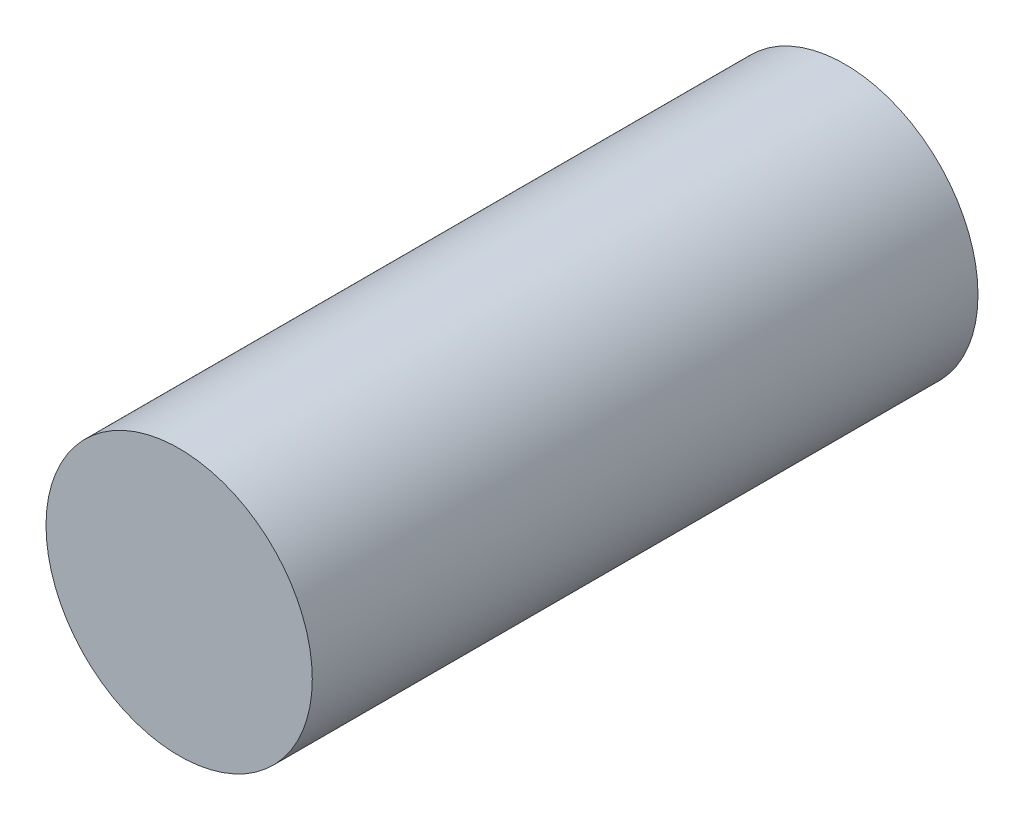
ISO-10303-21;
HEADER;
FILE_DESCRIPTION(('STEP AP214'),'2;1');
FILE_NAME('part.step','',(''),(''),'','','');
FILE_SCHEMA(('AUTOMOTIVE_DESIGN { 1 0 10303 214 1 1 1 1 }'));
ENDSEC;
DATA;
#1=APPLICATION_CONTEXT('core data for automotive mechanical design processes');
#2=APPLICATION_PROTOCOL_DEFINITION('international standard','automotive_design',2000,#1);
#3=PRODUCT_CONTEXT('',#1,'mechanical');
#4=PRODUCT('Part','Part','',(#3));
#5=PRODUCT_RELATED_PRODUCT_CATEGORY('part','',(#4));
#6=PRODUCT_DEFINITION_FORMATION('','',#4);
#7=PRODUCT_DEFINITION_CONTEXT('part definition',#1,'design');
#8=PRODUCT_DEFINITION('design','',#6,#7);
#9=PRODUCT_DEFINITION_SHAPE('','',#8);
#10=(LENGTH_UNIT() NAMED_UNIT(*) SI_UNIT(.MILLI.,.METRE.));
#11=(NAMED_UNIT(*) PLANE_ANGLE_UNIT() SI_UNIT($,.RADIAN.));
#12=(NAMED_UNIT(*) SI_UNIT($,.STERADIAN.) SOLID_ANGLE_UNIT());
#13=UNCERTAINTY_MEASURE_WITH_UNIT(LENGTH_MEASURE(1.E-05),#10,'distance_accuracy_value','');
#14=(GEOMETRIC_REPRESENTATION_CONTEXT(3) GLOBAL_UNCERTAINTY_ASSIGNED_CONTEXT((#13)) GLOBAL_UNIT_ASSIGNED_CONTEXT((#10,
#11,#12)) REPRESENTATION_CONTEXT('',''));
#15=CARTESIAN_POINT('',(0.,0.,0.));
#16=DIRECTION('',(0.,0.,1.));
#17=DIRECTION('',(1.,0.,0.));
#18=AXIS2_PLACEMENT_3D('',#15,#16,#17);
#19=CARTESIAN_POINT('',(0.,0.,100.));
#20=DIRECTION('',(0.,0.,-1.));
#21=DIRECTION('',(-1.,0.,0.));
#22=AXIS2_PLACEMENT_3D('',#19,#20,#21);
#23=CYLINDRICAL_SURFACE('',#22,20.);
#24=CARTESIAN_POINT('',(0.,0.,100.));
#25=DIRECTION('',(0.,0.,1.));
#26=DIRECTION('',(1.,0.,0.));
#27=AXIS2_PLACEMENT_3D('',#24,#25,#26);
#28=CIRCLE('',#27,20.);
#29=CARTESIAN_POINT('',(20.,0.,100.));
#30=VERTEX_POINT('',#29);
#31=EDGE_CURVE('E10',#30,#30,#28,.T.);
#32=ORIENTED_EDGE('',*,*,#31,.F.);
#33=EDGE_LOOP('',(#32));
#34=FACE_BOUND('',#33,.T.);
#35=CARTESIAN_POINT('',(0.,0.,0.));
#36=DIRECTION('',(0.,0.,1.));
#37=DIRECTION('',(1.,0.,0.));
#38=AXIS2_PLACEMENT_3D('',#35,#36,#37);
#39=CIRCLE('',#38,20.);
#40=CARTESIAN_POINT('',(20.,0.,0.));
#41=VERTEX_POINT('',#40);
#42=EDGE_CURVE('E40',#41,#41,#39,.T.);
#43=ORIENTED_EDGE('',*,*,#42,.T.);
#44=EDGE_LOOP('',(#43));
#45=FACE_BOUND('',#44,.T.);
#46=ADVANCED_FACE('F37',(#34,#45),#23,.T.);
#47=CARTESIAN_POINT('',(0.,0.,100.));
#48=DIRECTION('',(0.,0.,1.));
#49=DIRECTION('',(1.,0.,0.));
#50=AXIS2_PLACEMENT_3D('',#47,#48,#49);
#51=PLANE('',#50);
#52=ORIENTED_EDGE('',*,*,#31,.T.);
#53=EDGE_LOOP('',(#52));
#54=FACE_BOUND('',#53,.T.);
#55=ADVANCED_FACE('F52',(#54),#51,.T.);
#56=CARTESIAN_POINT('',(0.,0.,0.));
#57=DIRECTION('',(0.,0.,1.));
#58=DIRECTION('',(1.,0.,0.));
#59=AXIS2_PLACEMENT_3D('',#56,#57,#58);
#60=PLANE('',#59);
#61=ORIENTED_EDGE('',*,*,#42,.F.);
#62=EDGE_LOOP('',(#61));
#63=FACE_BOUND('',#62,.T.);
#64=ADVANCED_FACE('F50',(#63),#60,.F.);
#65=CLOSED_SHELL('',(#46,#55,#64));
#66=MANIFOLD_SOLID_BREP('B2',#65);
#67=ADVANCED_BREP_SHAPE_REPRESENTATION('',(#18,#66),#14);
#68=SHAPE_DEFINITION_REPRESENTATION(#9,#67);
ENDSEC;
END-ISO-10303-21;
